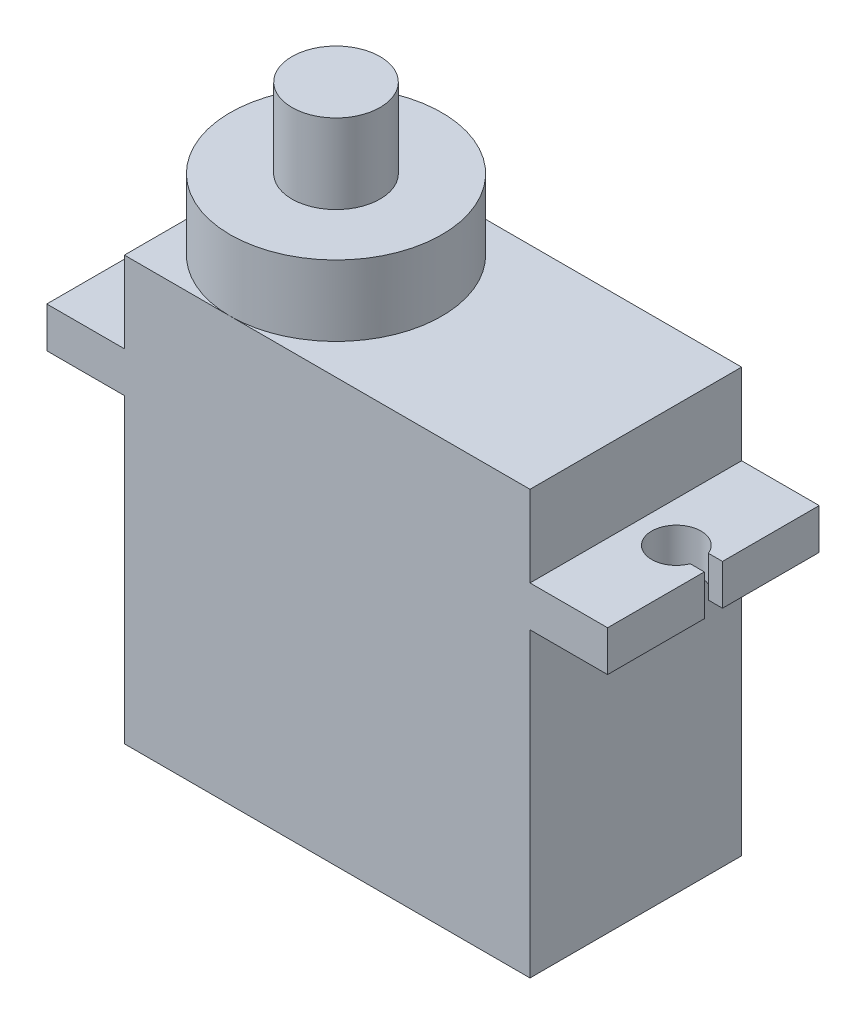
ISO-10303-21;
HEADER;
FILE_DESCRIPTION(('STEP AP214'),'2;1');
FILE_NAME('part.step','',(''),(''),'','','');
FILE_SCHEMA(('AUTOMOTIVE_DESIGN { 1 0 10303 214 1 1 1 1 }'));
ENDSEC;
DATA;
#1=APPLICATION_CONTEXT('core data for automotive mechanical design processes');
#2=APPLICATION_PROTOCOL_DEFINITION('international standard','automotive_design',2000,#1);
#3=PRODUCT_CONTEXT('',#1,'mechanical');
#4=PRODUCT('Part','Part','',(#3));
#5=PRODUCT_RELATED_PRODUCT_CATEGORY('part','',(#4));
#6=PRODUCT_DEFINITION_FORMATION('','',#4);
#7=PRODUCT_DEFINITION_CONTEXT('part definition',#1,'design');
#8=PRODUCT_DEFINITION('design','',#6,#7);
#9=PRODUCT_DEFINITION_SHAPE('','',#8);
#10=(LENGTH_UNIT() NAMED_UNIT(*) SI_UNIT(.MILLI.,.METRE.));
#11=(NAMED_UNIT(*) PLANE_ANGLE_UNIT() SI_UNIT($,.RADIAN.));
#12=(NAMED_UNIT(*) SI_UNIT($,.STERADIAN.) SOLID_ANGLE_UNIT());
#13=UNCERTAINTY_MEASURE_WITH_UNIT(LENGTH_MEASURE(1.E-05),#10,'distance_accuracy_value','');
#14=(GEOMETRIC_REPRESENTATION_CONTEXT(3) GLOBAL_UNCERTAINTY_ASSIGNED_CONTEXT((#13)) GLOBAL_UNIT_ASSIGNED_CONTEXT((#10,
#11,#12)) REPRESENTATION_CONTEXT('',''));
#15=CARTESIAN_POINT('',(0.,0.,0.));
#16=DIRECTION('',(0.,0.,1.));
#17=DIRECTION('',(1.,0.,0.));
#18=AXIS2_PLACEMENT_3D('',#15,#16,#17);
#19=CARTESIAN_POINT('',(0.,24.,0.));
#20=DIRECTION('',(0.,1.,0.));
#21=DIRECTION('',(0.,0.,1.));
#22=AXIS2_PLACEMENT_3D('',#19,#20,#21);
#23=PLANE('',#22);
#24=CARTESIAN_POINT('',(-5.5,24.,0.));
#25=DIRECTION('',(0.,1.,0.));
#26=DIRECTION('',(0.,0.,1.));
#27=AXIS2_PLACEMENT_3D('',#24,#25,#26);
#28=CIRCLE('',#27,6.);
#29=CARTESIAN_POINT('',(-5.5,24.,6.));
#30=VERTEX_POINT('',#29);
#31=CARTESIAN_POINT('',(-5.5,24.,-6.));
#32=VERTEX_POINT('',#31);
#33=EDGE_CURVE('E206',#30,#32,#28,.T.);
#34=ORIENTED_EDGE('',*,*,#33,.F.);
#35=DIRECTION('',(1.,0.,0.));
#36=VECTOR('',#35,1.);
#37=CARTESIAN_POINT('',(11.5,24.,6.));
#38=LINE('',#37,#36);
#39=CARTESIAN_POINT('',(11.5,24.,6.));
#40=VERTEX_POINT('',#39);
#41=EDGE_CURVE('E193',#30,#40,#38,.T.);
#42=ORIENTED_EDGE('',*,*,#41,.T.);
#43=DIRECTION('',(0.,0.,-1.));
#44=VECTOR('',#43,1.);
#45=CARTESIAN_POINT('',(11.5,24.,6.));
#46=LINE('',#45,#44);
#47=CARTESIAN_POINT('',(11.5,24.,-6.));
#48=VERTEX_POINT('',#47);
#49=EDGE_CURVE('E192',#40,#48,#46,.T.);
#50=ORIENTED_EDGE('',*,*,#49,.T.);
#51=DIRECTION('',(-1.,0.,0.));
#52=VECTOR('',#51,1.);
#53=CARTESIAN_POINT('',(11.5,24.,-6.));
#54=LINE('',#53,#52);
#55=EDGE_CURVE('E208',#48,#32,#54,.T.);
#56=ORIENTED_EDGE('',*,*,#55,.T.);
#57=EDGE_LOOP('',(#34,#42,#50,#56));
#58=FACE_BOUND('',#57,.T.);
#59=ADVANCED_FACE('F39',(#58),#23,.T.);
#60=CARTESIAN_POINT('',(-11.5,24.,0.));
#61=VERTEX_POINT('',#60);
#62=EDGE_CURVE('E48',#32,#61,#28,.T.);
#63=ORIENTED_EDGE('',*,*,#62,.F.);
#64=CARTESIAN_POINT('',(-11.5,24.,-6.));
#65=VERTEX_POINT('',#64);
#66=EDGE_CURVE('E330',#32,#65,#54,.T.);
#67=ORIENTED_EDGE('',*,*,#66,.T.);
#68=DIRECTION('',(0.,0.,1.));
#69=VECTOR('',#68,1.);
#70=CARTESIAN_POINT('',(-11.5,24.,6.));
#71=LINE('',#70,#69);
#72=EDGE_CURVE('E203',#65,#61,#71,.T.);
#73=ORIENTED_EDGE('',*,*,#72,.T.);
#74=EDGE_LOOP('',(#63,#67,#73));
#75=FACE_BOUND('',#74,.T.);
#76=ADVANCED_FACE('F385',(#75),#23,.T.);
#77=CARTESIAN_POINT('',(15.9,19.4,-6.));
#78=DIRECTION('',(0.,1.,0.));
#79=DIRECTION('',(0.,0.,1.));
#80=AXIS2_PLACEMENT_3D('',#77,#78,#79);
#81=PLANE('',#80);
#82=DIRECTION('',(0.,0.,-1.));
#83=VECTOR('',#82,1.);
#84=CARTESIAN_POINT('',(15.9,19.4,-6.));
#85=LINE('',#84,#83);
#86=CARTESIAN_POINT('',(15.9,19.4,6.));
#87=VERTEX_POINT('',#86);
#88=CARTESIAN_POINT('',(15.9,19.4,0.515720138550796));
#89=VERTEX_POINT('',#88);
#90=EDGE_CURVE('E249',#87,#89,#85,.T.);
#91=ORIENTED_EDGE('',*,*,#90,.T.);
#92=DIRECTION('',(-1.,0.,0.));
#93=VECTOR('',#92,1.);
#94=CARTESIAN_POINT('',(15.1015501291511,19.4,0.515720138550796));
#95=LINE('',#94,#93);
#96=CARTESIAN_POINT('',(15.1015501291511,19.4,0.515720138550796));
#97=VERTEX_POINT('',#96);
#98=EDGE_CURVE('E229',#89,#97,#95,.T.);
#99=ORIENTED_EDGE('',*,*,#98,.T.);
#100=CARTESIAN_POINT('',(13.8,19.4,0.));
#101=DIRECTION('',(0.,-1.,0.));
#102=DIRECTION('',(0.,0.,1.));
#103=AXIS2_PLACEMENT_3D('',#100,#101,#102);
#104=CIRCLE('',#103,1.4);
#105=CARTESIAN_POINT('',(15.1015501291511,19.4,-0.515720138550795));
#106=VERTEX_POINT('',#105);
#107=EDGE_CURVE('E226',#97,#106,#104,.T.);
#108=ORIENTED_EDGE('',*,*,#107,.T.);
#109=DIRECTION('',(1.,0.,0.));
#110=VECTOR('',#109,1.);
#111=CARTESIAN_POINT('',(15.1015501291511,19.4,-0.515720138550795));
#112=LINE('',#111,#110);
#113=CARTESIAN_POINT('',(15.9,19.4,-0.515720138550796));
#114=VERTEX_POINT('',#113);
#115=EDGE_CURVE('E223',#106,#114,#112,.T.);
#116=ORIENTED_EDGE('',*,*,#115,.T.);
#117=CARTESIAN_POINT('',(15.9,19.4,-6.));
#118=VERTEX_POINT('',#117);
#119=EDGE_CURVE('E247',#114,#118,#85,.T.);
#120=ORIENTED_EDGE('',*,*,#119,.T.);
#121=DIRECTION('',(-1.,0.,0.));
#122=VECTOR('',#121,1.);
#123=CARTESIAN_POINT('',(15.9,19.4,-6.));
#124=LINE('',#123,#122);
#125=CARTESIAN_POINT('',(11.5,19.4,-6.));
#126=VERTEX_POINT('',#125);
#127=EDGE_CURVE('E269',#118,#126,#124,.T.);
#128=ORIENTED_EDGE('',*,*,#127,.T.);
#129=DIRECTION('',(0.,0.,-1.));
#130=VECTOR('',#129,1.);
#131=CARTESIAN_POINT('',(11.5,19.4,-6.));
#132=LINE('',#131,#130);
#133=CARTESIAN_POINT('',(11.5,19.4,6.));
#134=VERTEX_POINT('',#133);
#135=EDGE_CURVE('E243',#134,#126,#132,.T.);
#136=ORIENTED_EDGE('',*,*,#135,.F.);
#137=DIRECTION('',(-1.,0.,0.));
#138=VECTOR('',#137,1.);
#139=CARTESIAN_POINT('',(15.9,19.4,6.));
#140=LINE('',#139,#138);
#141=EDGE_CURVE('E267',#87,#134,#140,.T.);
#142=ORIENTED_EDGE('',*,*,#141,.F.);
#143=EDGE_LOOP('',(#91,#99,#108,#116,#120,#128,#136,#142));
#144=FACE_BOUND('',#143,.T.);
#145=ADVANCED_FACE('F379',(#144),#81,.T.);
#146=CARTESIAN_POINT('',(15.9,17.1,-6.));
#147=DIRECTION('',(0.,-1.,0.));
#148=DIRECTION('',(0.,0.,-1.));
#149=AXIS2_PLACEMENT_3D('',#146,#147,#148);
#150=PLANE('',#149);
#151=CARTESIAN_POINT('',(13.8,17.1,0.));
#152=DIRECTION('',(0.,-1.,0.));
#153=DIRECTION('',(0.,0.,-1.));
#154=AXIS2_PLACEMENT_3D('',#151,#152,#153);
#155=CIRCLE('',#154,1.4);
#156=CARTESIAN_POINT('',(15.1015501291511,17.1,0.515720138550796));
#157=VERTEX_POINT('',#156);
#158=CARTESIAN_POINT('',(15.1015501291511,17.1,-0.515720138550795));
#159=VERTEX_POINT('',#158);
#160=EDGE_CURVE('E217',#157,#159,#155,.T.);
#161=ORIENTED_EDGE('',*,*,#160,.F.);
#162=DIRECTION('',(-1.,0.,0.));
#163=VECTOR('',#162,1.);
#164=CARTESIAN_POINT('',(15.1015501291511,17.1,0.515720138550796));
#165=LINE('',#164,#163);
#166=CARTESIAN_POINT('',(15.9,17.1,0.515720138550796));
#167=VERTEX_POINT('',#166);
#168=EDGE_CURVE('E220',#167,#157,#165,.T.);
#169=ORIENTED_EDGE('',*,*,#168,.F.);
#170=DIRECTION('',(0.,0.,1.));
#171=VECTOR('',#170,1.);
#172=CARTESIAN_POINT('',(15.9,17.1,-6.));
#173=LINE('',#172,#171);
#174=CARTESIAN_POINT('',(15.9,17.1,6.));
#175=VERTEX_POINT('',#174);
#176=EDGE_CURVE('E255',#167,#175,#173,.T.);
#177=ORIENTED_EDGE('',*,*,#176,.T.);
#178=DIRECTION('',(-1.,0.,0.));
#179=VECTOR('',#178,1.);
#180=CARTESIAN_POINT('',(15.9,17.1,6.));
#181=LINE('',#180,#179);
#182=CARTESIAN_POINT('',(11.5,17.1,6.));
#183=VERTEX_POINT('',#182);
#184=EDGE_CURVE('E265',#175,#183,#181,.T.);
#185=ORIENTED_EDGE('',*,*,#184,.T.);
#186=DIRECTION('',(0.,0.,1.));
#187=VECTOR('',#186,1.);
#188=CARTESIAN_POINT('',(11.5,17.1,-6.));
#189=LINE('',#188,#187);
#190=CARTESIAN_POINT('',(11.5,17.1,-6.));
#191=VERTEX_POINT('',#190);
#192=EDGE_CURVE('E248',#191,#183,#189,.T.);
#193=ORIENTED_EDGE('',*,*,#192,.F.);
#194=DIRECTION('',(-1.,0.,0.));
#195=VECTOR('',#194,1.);
#196=CARTESIAN_POINT('',(15.9,17.1,-6.));
#197=LINE('',#196,#195);
#198=CARTESIAN_POINT('',(15.9,17.1,-6.));
#199=VERTEX_POINT('',#198);
#200=EDGE_CURVE('E259',#199,#191,#197,.T.);
#201=ORIENTED_EDGE('',*,*,#200,.F.);
#202=CARTESIAN_POINT('',(15.9,17.1,-0.515720138550796));
#203=VERTEX_POINT('',#202);
#204=EDGE_CURVE('E256',#199,#203,#173,.T.);
#205=ORIENTED_EDGE('',*,*,#204,.T.);
#206=DIRECTION('',(1.,0.,0.));
#207=VECTOR('',#206,1.);
#208=CARTESIAN_POINT('',(15.1015501291511,17.1,-0.515720138550795));
#209=LINE('',#208,#207);
#210=EDGE_CURVE('E236',#159,#203,#209,.T.);
#211=ORIENTED_EDGE('',*,*,#210,.F.);
#212=EDGE_LOOP('',(#161,#169,#177,#185,#193,#201,#205,#211));
#213=FACE_BOUND('',#212,.T.);
#214=ADVANCED_FACE('F371',(#213),#150,.T.);
#215=CARTESIAN_POINT('',(15.9,0.,0.));
#216=DIRECTION('',(-1.,0.,0.));
#217=DIRECTION('',(0.,0.,-1.));
#218=AXIS2_PLACEMENT_3D('',#215,#216,#217);
#219=PLANE('',#218);
#220=DIRECTION('',(0.,1.,0.));
#221=VECTOR('',#220,1.);
#222=CARTESIAN_POINT('',(15.9,-0.001000000000001,0.515720138550796));
#223=LINE('',#222,#221);
#224=EDGE_CURVE('E233',#167,#89,#223,.T.);
#225=ORIENTED_EDGE('',*,*,#224,.T.);
#226=ORIENTED_EDGE('',*,*,#90,.F.);
#227=DIRECTION('',(0.,1.,0.));
#228=VECTOR('',#227,1.);
#229=CARTESIAN_POINT('',(15.9,17.1,6.));
#230=LINE('',#229,#228);
#231=EDGE_CURVE('E252',#175,#87,#230,.T.);
#232=ORIENTED_EDGE('',*,*,#231,.F.);
#233=ORIENTED_EDGE('',*,*,#176,.F.);
#234=EDGE_LOOP('',(#225,#226,#232,#233));
#235=FACE_BOUND('',#234,.T.);
#236=ADVANCED_FACE('F377',(#235),#219,.F.);
#237=DIRECTION('',(0.,1.,0.));
#238=VECTOR('',#237,1.);
#239=CARTESIAN_POINT('',(15.9,-0.001000000000001,-0.515720138550796));
#240=LINE('',#239,#238);
#241=EDGE_CURVE('E232',#203,#114,#240,.T.);
#242=ORIENTED_EDGE('',*,*,#241,.F.);
#243=ORIENTED_EDGE('',*,*,#204,.F.);
#244=DIRECTION('',(0.,-1.,0.));
#245=VECTOR('',#244,1.);
#246=CARTESIAN_POINT('',(15.9,17.1,-6.));
#247=LINE('',#246,#245);
#248=EDGE_CURVE('E244',#118,#199,#247,.T.);
#249=ORIENTED_EDGE('',*,*,#248,.F.);
#250=ORIENTED_EDGE('',*,*,#119,.F.);
#251=EDGE_LOOP('',(#242,#243,#249,#250));
#252=FACE_BOUND('',#251,.T.);
#253=ADVANCED_FACE('F437',(#252),#219,.F.);
#254=CARTESIAN_POINT('',(11.5,24.,6.));
#255=DIRECTION('',(-1.,0.,0.));
#256=DIRECTION('',(0.,0.,1.));
#257=AXIS2_PLACEMENT_3D('',#254,#255,#256);
#258=PLANE('',#257);
#259=DIRECTION('',(0.,-1.,0.));
#260=VECTOR('',#259,1.);
#261=CARTESIAN_POINT('',(11.5,24.,-6.));
#262=LINE('',#261,#260);
#263=CARTESIAN_POINT('',(11.5,0.,-6.));
#264=VERTEX_POINT('',#263);
#265=EDGE_CURVE('E345',#191,#264,#262,.T.);
#266=ORIENTED_EDGE('',*,*,#265,.F.);
#267=ORIENTED_EDGE('',*,*,#192,.T.);
#268=DIRECTION('',(0.,-1.,0.));
#269=VECTOR('',#268,1.);
#270=CARTESIAN_POINT('',(11.5,24.,6.));
#271=LINE('',#270,#269);
#272=CARTESIAN_POINT('',(11.5,0.,6.));
#273=VERTEX_POINT('',#272);
#274=EDGE_CURVE('E348',#183,#273,#271,.T.);
#275=ORIENTED_EDGE('',*,*,#274,.T.);
#276=DIRECTION('',(0.,0.,-1.));
#277=VECTOR('',#276,1.);
#278=CARTESIAN_POINT('',(11.5,0.,6.));
#279=LINE('',#278,#277);
#280=EDGE_CURVE('E337',#273,#264,#279,.T.);
#281=ORIENTED_EDGE('',*,*,#280,.T.);
#282=EDGE_LOOP('',(#266,#267,#275,#281));
#283=FACE_BOUND('',#282,.T.);
#284=ADVANCED_FACE('F353',(#283),#258,.F.);
#285=CARTESIAN_POINT('',(-15.9,0.,0.));
#286=DIRECTION('',(1.,0.,0.));
#287=DIRECTION('',(0.,0.,-1.));
#288=AXIS2_PLACEMENT_3D('',#285,#286,#287);
#289=PLANE('',#288);
#290=DIRECTION('',(0.,0.,1.));
#291=VECTOR('',#290,1.);
#292=CARTESIAN_POINT('',(-15.9,17.1,-6.));
#293=LINE('',#292,#291);
#294=CARTESIAN_POINT('',(-15.9,17.1,-6.));
#295=VERTEX_POINT('',#294);
#296=CARTESIAN_POINT('',(-15.9,17.1,-0.515720138550796));
#297=VERTEX_POINT('',#296);
#298=EDGE_CURVE('E302',#295,#297,#293,.T.);
#299=ORIENTED_EDGE('',*,*,#298,.T.);
#300=DIRECTION('',(0.,1.,0.));
#301=VECTOR('',#300,1.);
#302=CARTESIAN_POINT('',(-15.9,-0.001000000000001,-0.515720138550796));
#303=LINE('',#302,#301);
#304=CARTESIAN_POINT('',(-15.9,19.4,-0.515720138550796));
#305=VERTEX_POINT('',#304);
#306=EDGE_CURVE('E286',#297,#305,#303,.T.);
#307=ORIENTED_EDGE('',*,*,#306,.T.);
#308=DIRECTION('',(0.,0.,-1.));
#309=VECTOR('',#308,1.);
#310=CARTESIAN_POINT('',(-15.9,19.4,-6.));
#311=LINE('',#310,#309);
#312=CARTESIAN_POINT('',(-15.9,19.4,-6.));
#313=VERTEX_POINT('',#312);
#314=EDGE_CURVE('E307',#305,#313,#311,.T.);
#315=ORIENTED_EDGE('',*,*,#314,.T.);
#316=DIRECTION('',(0.,-1.,0.));
#317=VECTOR('',#316,1.);
#318=CARTESIAN_POINT('',(-15.9,17.1,-6.));
#319=LINE('',#318,#317);
#320=EDGE_CURVE('E297',#313,#295,#319,.T.);
#321=ORIENTED_EDGE('',*,*,#320,.T.);
#322=EDGE_LOOP('',(#299,#307,#315,#321));
#323=FACE_BOUND('',#322,.T.);
#324=ADVANCED_FACE('F414',(#323),#289,.F.);
#325=CARTESIAN_POINT('',(-11.5,24.,6.));
#326=DIRECTION('',(1.,0.,0.));
#327=DIRECTION('',(0.,0.,-1.));
#328=AXIS2_PLACEMENT_3D('',#325,#326,#327);
#329=PLANE('',#328);
#330=DIRECTION('',(0.,0.,-1.));
#331=VECTOR('',#330,1.);
#332=CARTESIAN_POINT('',(-11.5,19.4,-6.));
#333=LINE('',#332,#331);
#334=CARTESIAN_POINT('',(-11.5,19.4,6.));
#335=VERTEX_POINT('',#334);
#336=CARTESIAN_POINT('',(-11.5,19.4,-6.));
#337=VERTEX_POINT('',#336);
#338=EDGE_CURVE('E301',#335,#337,#333,.T.);
#339=ORIENTED_EDGE('',*,*,#338,.F.);
#340=DIRECTION('',(0.,-1.,0.));
#341=VECTOR('',#340,1.);
#342=CARTESIAN_POINT('',(-11.5,24.,6.));
#343=LINE('',#342,#341);
#344=CARTESIAN_POINT('',(-11.5,24.,6.));
#345=VERTEX_POINT('',#344);
#346=EDGE_CURVE('E43',#345,#335,#343,.T.);
#347=ORIENTED_EDGE('',*,*,#346,.F.);
#348=EDGE_CURVE('E188',#61,#345,#71,.T.);
#349=ORIENTED_EDGE('',*,*,#348,.F.);
#350=ORIENTED_EDGE('',*,*,#72,.F.);
#351=DIRECTION('',(0.,-1.,0.));
#352=VECTOR('',#351,1.);
#353=CARTESIAN_POINT('',(-11.5,24.,-6.));
#354=LINE('',#353,#352);
#355=EDGE_CURVE('E343',#65,#337,#354,.T.);
#356=ORIENTED_EDGE('',*,*,#355,.T.);
#357=EDGE_LOOP('',(#339,#347,#349,#350,#356));
#358=FACE_BOUND('',#357,.T.);
#359=ADVANCED_FACE('F41',(#358),#329,.F.);
#360=DIRECTION('',(0.,0.,1.));
#361=VECTOR('',#360,1.);
#362=CARTESIAN_POINT('',(-11.5,17.1,-6.));
#363=LINE('',#362,#361);
#364=CARTESIAN_POINT('',(-11.5,17.1,-6.));
#365=VERTEX_POINT('',#364);
#366=CARTESIAN_POINT('',(-11.5,17.1,6.));
#367=VERTEX_POINT('',#366);
#368=EDGE_CURVE('E296',#365,#367,#363,.T.);
#369=ORIENTED_EDGE('',*,*,#368,.F.);
#370=CARTESIAN_POINT('',(-11.5,0.,-6.));
#371=VERTEX_POINT('',#370);
#372=EDGE_CURVE('E332',#365,#371,#354,.T.);
#373=ORIENTED_EDGE('',*,*,#372,.T.);
#374=DIRECTION('',(0.,0.,1.));
#375=VECTOR('',#374,1.);
#376=CARTESIAN_POINT('',(-11.5,0.,6.));
#377=LINE('',#376,#375);
#378=CARTESIAN_POINT('',(-11.5,0.,6.));
#379=VERTEX_POINT('',#378);
#380=EDGE_CURVE('E327',#371,#379,#377,.T.);
#381=ORIENTED_EDGE('',*,*,#380,.T.);
#382=EDGE_CURVE('E214',#367,#379,#343,.T.);
#383=ORIENTED_EDGE('',*,*,#382,.F.);
#384=EDGE_LOOP('',(#369,#373,#381,#383));
#385=FACE_BOUND('',#384,.T.);
#386=ADVANCED_FACE('F406',(#385),#329,.F.);
#387=CARTESIAN_POINT('',(11.5,24.,6.));
#388=DIRECTION('',(0.,0.,-1.));
#389=DIRECTION('',(-1.,0.,0.));
#390=AXIS2_PLACEMENT_3D('',#387,#388,#389);
#391=PLANE('',#390);
#392=DIRECTION('',(1.,0.,0.));
#393=VECTOR('',#392,1.);
#394=CARTESIAN_POINT('',(11.5,0.,6.));
#395=LINE('',#394,#393);
#396=EDGE_CURVE('E335',#379,#273,#395,.T.);
#397=ORIENTED_EDGE('',*,*,#396,.T.);
#398=ORIENTED_EDGE('',*,*,#274,.F.);
#399=ORIENTED_EDGE('',*,*,#184,.F.);
#400=ORIENTED_EDGE('',*,*,#231,.T.);
#401=ORIENTED_EDGE('',*,*,#141,.T.);
#402=EDGE_CURVE('E200',#40,#134,#271,.T.);
#403=ORIENTED_EDGE('',*,*,#402,.F.);
#404=ORIENTED_EDGE('',*,*,#41,.F.);
#405=EDGE_CURVE('E185',#345,#30,#38,.T.);
#406=ORIENTED_EDGE('',*,*,#405,.F.);
#407=ORIENTED_EDGE('',*,*,#346,.T.);
#408=DIRECTION('',(1.,0.,0.));
#409=VECTOR('',#408,1.);
#410=CARTESIAN_POINT('',(-15.9,19.4,6.));
#411=LINE('',#410,#409);
#412=CARTESIAN_POINT('',(-15.9,19.4,6.));
#413=VERTEX_POINT('',#412);
#414=EDGE_CURVE('E318',#413,#335,#411,.T.);
#415=ORIENTED_EDGE('',*,*,#414,.F.);
#416=DIRECTION('',(0.,1.,0.));
#417=VECTOR('',#416,1.);
#418=CARTESIAN_POINT('',(-15.9,17.1,6.));
#419=LINE('',#418,#417);
#420=CARTESIAN_POINT('',(-15.9,17.1,6.));
#421=VERTEX_POINT('',#420);
#422=EDGE_CURVE('E305',#421,#413,#419,.T.);
#423=ORIENTED_EDGE('',*,*,#422,.F.);
#424=DIRECTION('',(1.,0.,0.));
#425=VECTOR('',#424,1.);
#426=CARTESIAN_POINT('',(-15.9,17.1,6.));
#427=LINE('',#426,#425);
#428=EDGE_CURVE('E321',#421,#367,#427,.T.);
#429=ORIENTED_EDGE('',*,*,#428,.T.);
#430=ORIENTED_EDGE('',*,*,#382,.T.);
#431=EDGE_LOOP('',(#397,#398,#399,#400,#401,#403,#404,#406,#407,#415,#423,#429,#430));
#432=FACE_BOUND('',#431,.T.);
#433=ADVANCED_FACE('F198',(#432),#391,.F.);
#434=ORIENTED_EDGE('',*,*,#402,.T.);
#435=ORIENTED_EDGE('',*,*,#135,.T.);
#436=EDGE_CURVE('E346',#48,#126,#262,.T.);
#437=ORIENTED_EDGE('',*,*,#436,.F.);
#438=ORIENTED_EDGE('',*,*,#49,.F.);
#439=EDGE_LOOP('',(#434,#435,#437,#438));
#440=FACE_BOUND('',#439,.T.);
#441=ADVANCED_FACE('F382',(#440),#258,.F.);
#442=CARTESIAN_POINT('',(11.5,24.,-6.));
#443=DIRECTION('',(0.,0.,1.));
#444=DIRECTION('',(1.,0.,0.));
#445=AXIS2_PLACEMENT_3D('',#442,#443,#444);
#446=PLANE('',#445);
#447=DIRECTION('',(-1.,0.,0.));
#448=VECTOR('',#447,1.);
#449=CARTESIAN_POINT('',(11.5,0.,-6.));
#450=LINE('',#449,#448);
#451=EDGE_CURVE('E340',#264,#371,#450,.T.);
#452=ORIENTED_EDGE('',*,*,#451,.T.);
#453=ORIENTED_EDGE('',*,*,#372,.F.);
#454=DIRECTION('',(1.,0.,0.));
#455=VECTOR('',#454,1.);
#456=CARTESIAN_POINT('',(-15.9,17.1,-6.));
#457=LINE('',#456,#455);
#458=EDGE_CURVE('E324',#295,#365,#457,.T.);
#459=ORIENTED_EDGE('',*,*,#458,.F.);
#460=ORIENTED_EDGE('',*,*,#320,.F.);
#461=DIRECTION('',(1.,0.,0.));
#462=VECTOR('',#461,1.);
#463=CARTESIAN_POINT('',(-15.9,19.4,-6.));
#464=LINE('',#463,#462);
#465=EDGE_CURVE('E311',#313,#337,#464,.T.);
#466=ORIENTED_EDGE('',*,*,#465,.T.);
#467=ORIENTED_EDGE('',*,*,#355,.F.);
#468=ORIENTED_EDGE('',*,*,#66,.F.);
#469=ORIENTED_EDGE('',*,*,#55,.F.);
#470=ORIENTED_EDGE('',*,*,#436,.T.);
#471=ORIENTED_EDGE('',*,*,#127,.F.);
#472=ORIENTED_EDGE('',*,*,#248,.T.);
#473=ORIENTED_EDGE('',*,*,#200,.T.);
#474=ORIENTED_EDGE('',*,*,#265,.T.);
#475=EDGE_LOOP('',(#452,#453,#459,#460,#466,#467,#468,#469,#470,#471,#472,#473,#474));
#476=FACE_BOUND('',#475,.T.);
#477=ADVANCED_FACE('F364',(#476),#446,.F.);
#478=EDGE_CURVE('E63',#61,#30,#28,.T.);
#479=ORIENTED_EDGE('',*,*,#478,.F.);
#480=ORIENTED_EDGE('',*,*,#348,.T.);
#481=ORIENTED_EDGE('',*,*,#405,.T.);
#482=EDGE_LOOP('',(#479,#480,#481));
#483=FACE_BOUND('',#482,.T.);
#484=ADVANCED_FACE('F187',(#483),#23,.T.);
#485=CARTESIAN_POINT('',(0.,0.,0.));
#486=DIRECTION('',(0.,1.,0.));
#487=DIRECTION('',(0.,0.,1.));
#488=AXIS2_PLACEMENT_3D('',#485,#486,#487);
#489=PLANE('',#488);
#490=ORIENTED_EDGE('',*,*,#380,.F.);
#491=ORIENTED_EDGE('',*,*,#451,.F.);
#492=ORIENTED_EDGE('',*,*,#280,.F.);
#493=ORIENTED_EDGE('',*,*,#396,.F.);
#494=EDGE_LOOP('',(#490,#491,#492,#493));
#495=FACE_BOUND('',#494,.T.);
#496=ADVANCED_FACE('F361',(#495),#489,.F.);
#497=CARTESIAN_POINT('',(-15.9,17.1,-6.));
#498=DIRECTION('',(0.,1.,0.));
#499=DIRECTION('',(0.,0.,1.));
#500=AXIS2_PLACEMENT_3D('',#497,#498,#499);
#501=PLANE('',#500);
#502=CARTESIAN_POINT('',(-13.8,17.1,0.));
#503=DIRECTION('',(0.,1.,0.));
#504=DIRECTION('',(0.,0.,1.));
#505=AXIS2_PLACEMENT_3D('',#502,#503,#504);
#506=CIRCLE('',#505,1.4);
#507=CARTESIAN_POINT('',(-15.1015501291511,17.1,-0.515720138550795));
#508=VERTEX_POINT('',#507);
#509=CARTESIAN_POINT('',(-15.1015501291511,17.1,0.515720138550796));
#510=VERTEX_POINT('',#509);
#511=EDGE_CURVE('E271',#508,#510,#506,.F.);
#512=ORIENTED_EDGE('',*,*,#511,.F.);
#513=DIRECTION('',(1.,0.,0.));
#514=VECTOR('',#513,1.);
#515=CARTESIAN_POINT('',(-15.1015501291511,17.1,-0.515720138550795));
#516=LINE('',#515,#514);
#517=EDGE_CURVE('E274',#297,#508,#516,.T.);
#518=ORIENTED_EDGE('',*,*,#517,.F.);
#519=ORIENTED_EDGE('',*,*,#298,.F.);
#520=ORIENTED_EDGE('',*,*,#458,.T.);
#521=ORIENTED_EDGE('',*,*,#368,.T.);
#522=ORIENTED_EDGE('',*,*,#428,.F.);
#523=CARTESIAN_POINT('',(-15.9,17.1,0.515720138550797));
#524=VERTEX_POINT('',#523);
#525=EDGE_CURVE('E300',#524,#421,#293,.T.);
#526=ORIENTED_EDGE('',*,*,#525,.F.);
#527=DIRECTION('',(-1.,0.,0.));
#528=VECTOR('',#527,1.);
#529=CARTESIAN_POINT('',(-15.1015501291511,17.1,0.515720138550796));
#530=LINE('',#529,#528);
#531=EDGE_CURVE('E289',#510,#524,#530,.T.);
#532=ORIENTED_EDGE('',*,*,#531,.F.);
#533=EDGE_LOOP('',(#512,#518,#519,#520,#521,#522,#526,#532));
#534=FACE_BOUND('',#533,.T.);
#535=ADVANCED_FACE('F403',(#534),#501,.F.);
#536=CARTESIAN_POINT('',(-15.9,19.4,-6.));
#537=DIRECTION('',(0.,-1.,0.));
#538=DIRECTION('',(0.,0.,-1.));
#539=AXIS2_PLACEMENT_3D('',#536,#537,#538);
#540=PLANE('',#539);
#541=ORIENTED_EDGE('',*,*,#314,.F.);
#542=DIRECTION('',(-1.,0.,0.));
#543=VECTOR('',#542,1.);
#544=CARTESIAN_POINT('',(-15.1015501291511,19.4,-0.515720138550795));
#545=LINE('',#544,#543);
#546=CARTESIAN_POINT('',(-15.1015501291511,19.4,-0.515720138550795));
#547=VERTEX_POINT('',#546);
#548=EDGE_CURVE('E283',#547,#305,#545,.T.);
#549=ORIENTED_EDGE('',*,*,#548,.F.);
#550=CARTESIAN_POINT('',(-13.8,19.4,0.));
#551=DIRECTION('',(0.,1.,0.));
#552=DIRECTION('',(0.,0.,1.));
#553=AXIS2_PLACEMENT_3D('',#550,#551,#552);
#554=CIRCLE('',#553,1.4);
#555=CARTESIAN_POINT('',(-15.1015501291511,19.4,0.515720138550796));
#556=VERTEX_POINT('',#555);
#557=EDGE_CURVE('E280',#556,#547,#554,.T.);
#558=ORIENTED_EDGE('',*,*,#557,.F.);
#559=DIRECTION('',(1.,0.,0.));
#560=VECTOR('',#559,1.);
#561=CARTESIAN_POINT('',(-15.1015501291511,19.4,0.515720138550796));
#562=LINE('',#561,#560);
#563=CARTESIAN_POINT('',(-15.9,19.4,0.515720138550796));
#564=VERTEX_POINT('',#563);
#565=EDGE_CURVE('E277',#564,#556,#562,.T.);
#566=ORIENTED_EDGE('',*,*,#565,.F.);
#567=EDGE_CURVE('E308',#413,#564,#311,.T.);
#568=ORIENTED_EDGE('',*,*,#567,.F.);
#569=ORIENTED_EDGE('',*,*,#414,.T.);
#570=ORIENTED_EDGE('',*,*,#338,.T.);
#571=ORIENTED_EDGE('',*,*,#465,.F.);
#572=EDGE_LOOP('',(#541,#549,#558,#566,#568,#569,#570,#571));
#573=FACE_BOUND('',#572,.T.);
#574=ADVANCED_FACE('F392',(#573),#540,.F.);
#575=ORIENTED_EDGE('',*,*,#567,.T.);
#576=DIRECTION('',(0.,1.,0.));
#577=VECTOR('',#576,1.);
#578=CARTESIAN_POINT('',(-15.9,-0.001000000000001,0.515720138550796));
#579=LINE('',#578,#577);
#580=EDGE_CURVE('E285',#524,#564,#579,.T.);
#581=ORIENTED_EDGE('',*,*,#580,.F.);
#582=ORIENTED_EDGE('',*,*,#525,.T.);
#583=ORIENTED_EDGE('',*,*,#422,.T.);
#584=EDGE_LOOP('',(#575,#581,#582,#583));
#585=FACE_BOUND('',#584,.T.);
#586=ADVANCED_FACE('F398',(#585),#289,.F.);
#587=CARTESIAN_POINT('',(-15.1015501291511,-0.001000000000001,-0.515720138550795));
#588=DIRECTION('',(0.,0.,-1.));
#589=DIRECTION('',(-1.,0.,0.));
#590=AXIS2_PLACEMENT_3D('',#587,#588,#589);
#591=PLANE('',#590);
#592=ORIENTED_EDGE('',*,*,#517,.T.);
#593=DIRECTION('',(0.,1.,0.));
#594=VECTOR('',#593,1.);
#595=CARTESIAN_POINT('',(-15.1015501291511,-0.001000000000001,-0.515720138550795));
#596=LINE('',#595,#594);
#597=EDGE_CURVE('E290',#508,#547,#596,.T.);
#598=ORIENTED_EDGE('',*,*,#597,.T.);
#599=ORIENTED_EDGE('',*,*,#548,.T.);
#600=ORIENTED_EDGE('',*,*,#306,.F.);
#601=EDGE_LOOP('',(#592,#598,#599,#600));
#602=FACE_BOUND('',#601,.T.);
#603=ADVANCED_FACE('F457',(#602),#591,.F.);
#604=CARTESIAN_POINT('',(-13.8,-0.001000000000001,0.));
#605=DIRECTION('',(0.,1.,0.));
#606=DIRECTION('',(0.,0.,1.));
#607=AXIS2_PLACEMENT_3D('',#604,#605,#606);
#608=CYLINDRICAL_SURFACE('',#607,1.4);
#609=ORIENTED_EDGE('',*,*,#511,.T.);
#610=DIRECTION('',(0.,1.,0.));
#611=VECTOR('',#610,1.);
#612=CARTESIAN_POINT('',(-15.1015501291511,-0.001000000000001,0.515720138550796));
#613=LINE('',#612,#611);
#614=EDGE_CURVE('E292',#510,#556,#613,.T.);
#615=ORIENTED_EDGE('',*,*,#614,.T.);
#616=ORIENTED_EDGE('',*,*,#557,.T.);
#617=ORIENTED_EDGE('',*,*,#597,.F.);
#618=EDGE_LOOP('',(#609,#615,#616,#617));
#619=FACE_BOUND('',#618,.T.);
#620=ADVANCED_FACE('F460',(#619),#608,.F.);
#621=CARTESIAN_POINT('',(-15.1015501291511,-0.001000000000001,0.515720138550796));
#622=DIRECTION('',(0.,0.,1.));
#623=DIRECTION('',(1.,0.,0.));
#624=AXIS2_PLACEMENT_3D('',#621,#622,#623);
#625=PLANE('',#624);
#626=ORIENTED_EDGE('',*,*,#531,.T.);
#627=ORIENTED_EDGE('',*,*,#580,.T.);
#628=ORIENTED_EDGE('',*,*,#565,.T.);
#629=ORIENTED_EDGE('',*,*,#614,.F.);
#630=EDGE_LOOP('',(#626,#627,#628,#629));
#631=FACE_BOUND('',#630,.T.);
#632=ADVANCED_FACE('F464',(#631),#625,.F.);
#633=CARTESIAN_POINT('',(15.1015501291511,-0.001000000000001,0.515720138550796));
#634=DIRECTION('',(0.,0.,-1.));
#635=DIRECTION('',(-1.,0.,0.));
#636=AXIS2_PLACEMENT_3D('',#633,#634,#635);
#637=PLANE('',#636);
#638=ORIENTED_EDGE('',*,*,#168,.T.);
#639=DIRECTION('',(0.,1.,0.));
#640=VECTOR('',#639,1.);
#641=CARTESIAN_POINT('',(15.1015501291511,-0.001000000000001,0.515720138550796));
#642=LINE('',#641,#640);
#643=EDGE_CURVE('E237',#157,#97,#642,.T.);
#644=ORIENTED_EDGE('',*,*,#643,.T.);
#645=ORIENTED_EDGE('',*,*,#98,.F.);
#646=ORIENTED_EDGE('',*,*,#224,.F.);
#647=EDGE_LOOP('',(#638,#644,#645,#646));
#648=FACE_BOUND('',#647,.T.);
#649=ADVANCED_FACE('F467',(#648),#637,.T.);
#650=CARTESIAN_POINT('',(13.8,-0.001000000000001,0.));
#651=DIRECTION('',(0.,1.,0.));
#652=DIRECTION('',(0.,0.,1.));
#653=AXIS2_PLACEMENT_3D('',#650,#651,#652);
#654=CYLINDRICAL_SURFACE('',#653,1.4);
#655=ORIENTED_EDGE('',*,*,#160,.T.);
#656=DIRECTION('',(0.,1.,0.));
#657=VECTOR('',#656,1.);
#658=CARTESIAN_POINT('',(15.1015501291511,-0.001000000000001,-0.515720138550795));
#659=LINE('',#658,#657);
#660=EDGE_CURVE('E239',#159,#106,#659,.T.);
#661=ORIENTED_EDGE('',*,*,#660,.T.);
#662=ORIENTED_EDGE('',*,*,#107,.F.);
#663=ORIENTED_EDGE('',*,*,#643,.F.);
#664=EDGE_LOOP('',(#655,#661,#662,#663));
#665=FACE_BOUND('',#664,.T.);
#666=ADVANCED_FACE('F638',(#665),#654,.F.);
#667=CARTESIAN_POINT('',(15.1015501291511,-0.001000000000001,-0.515720138550795));
#668=DIRECTION('',(0.,0.,1.));
#669=DIRECTION('',(1.,0.,0.));
#670=AXIS2_PLACEMENT_3D('',#667,#668,#669);
#671=PLANE('',#670);
#672=ORIENTED_EDGE('',*,*,#210,.T.);
#673=ORIENTED_EDGE('',*,*,#241,.T.);
#674=ORIENTED_EDGE('',*,*,#115,.F.);
#675=ORIENTED_EDGE('',*,*,#660,.F.);
#676=EDGE_LOOP('',(#672,#673,#674,#675));
#677=FACE_BOUND('',#676,.T.);
#678=ADVANCED_FACE('F451',(#677),#671,.T.);
#679=CARTESIAN_POINT('',(-5.5,28.,0.));
#680=DIRECTION('',(0.,-1.,0.));
#681=DIRECTION('',(0.,0.,-1.));
#682=AXIS2_PLACEMENT_3D('',#679,#680,#681);
#683=CYLINDRICAL_SURFACE('',#682,6.);
#684=CARTESIAN_POINT('',(-5.5,28.,0.));
#685=DIRECTION('',(0.,1.,0.));
#686=DIRECTION('',(0.,0.,1.));
#687=AXIS2_PLACEMENT_3D('',#684,#685,#686);
#688=CIRCLE('',#687,6.);
#689=CARTESIAN_POINT('',(-5.5,28.,6.));
#690=VERTEX_POINT('',#689);
#691=EDGE_CURVE('E210',#690,#690,#688,.T.);
#692=ORIENTED_EDGE('',*,*,#691,.F.);
#693=EDGE_LOOP('',(#692));
#694=FACE_BOUND('',#693,.T.);
#695=ORIENTED_EDGE('',*,*,#33,.T.);
#696=ORIENTED_EDGE('',*,*,#62,.T.);
#697=ORIENTED_EDGE('',*,*,#478,.T.);
#698=EDGE_LOOP('',(#695,#696,#697));
#699=FACE_BOUND('',#698,.T.);
#700=ADVANCED_FACE('F213',(#694,#699),#683,.T.);
#701=CARTESIAN_POINT('',(-5.5,28.,0.));
#702=DIRECTION('',(0.,1.,0.));
#703=DIRECTION('',(0.,0.,1.));
#704=AXIS2_PLACEMENT_3D('',#701,#702,#703);
#705=PLANE('',#704);
#706=CARTESIAN_POINT('',(-5.5,28.,0.));
#707=DIRECTION('',(0.,1.,0.));
#708=DIRECTION('',(0.,0.,1.));
#709=AXIS2_PLACEMENT_3D('',#706,#707,#708);
#710=CIRCLE('',#709,2.5);
#711=CARTESIAN_POINT('',(-5.5,28.,2.5));
#712=VERTEX_POINT('',#711);
#713=EDGE_CURVE('E11',#712,#712,#710,.T.);
#714=ORIENTED_EDGE('',*,*,#713,.F.);
#715=EDGE_LOOP('',(#714));
#716=FACE_BOUND('',#715,.T.);
#717=ORIENTED_EDGE('',*,*,#691,.T.);
#718=EDGE_LOOP('',(#717));
#719=FACE_BOUND('',#718,.T.);
#720=ADVANCED_FACE('F602',(#716,#719),#705,.T.);
#721=CARTESIAN_POINT('',(-5.5,32.5,0.));
#722=DIRECTION('',(0.,-1.,0.));
#723=DIRECTION('',(0.,0.,-1.));
#724=AXIS2_PLACEMENT_3D('',#721,#722,#723);
#725=CYLINDRICAL_SURFACE('',#724,2.5);
#726=CARTESIAN_POINT('',(-5.5,32.5,0.));
#727=DIRECTION('',(0.,1.,0.));
#728=DIRECTION('',(0.,0.,1.));
#729=AXIS2_PLACEMENT_3D('',#726,#727,#728);
#730=CIRCLE('',#729,2.5);
#731=CARTESIAN_POINT('',(-5.5,32.5,2.5));
#732=VERTEX_POINT('',#731);
#733=EDGE_CURVE('E211',#732,#732,#730,.T.);
#734=ORIENTED_EDGE('',*,*,#733,.F.);
#735=EDGE_LOOP('',(#734));
#736=FACE_BOUND('',#735,.T.);
#737=ORIENTED_EDGE('',*,*,#713,.T.);
#738=EDGE_LOOP('',(#737));
#739=FACE_BOUND('',#738,.T.);
#740=ADVANCED_FACE('F611',(#736,#739),#725,.T.);
#741=CARTESIAN_POINT('',(-5.5,32.5,0.));
#742=DIRECTION('',(0.,1.,0.));
#743=DIRECTION('',(0.,0.,1.));
#744=AXIS2_PLACEMENT_3D('',#741,#742,#743);
#745=PLANE('',#744);
#746=ORIENTED_EDGE('',*,*,#733,.T.);
#747=EDGE_LOOP('',(#746));
#748=FACE_BOUND('',#747,.T.);
#749=ADVANCED_FACE('F620',(#748),#745,.T.);
#750=CLOSED_SHELL('',(#59,#76,#145,#214,#236,#253,#284,#324,#359,#386,#433,#441,#477,#484,#496,
#535,#574,#586,#603,#620,#632,#649,#666,#678,#700,#720,#740,#749));
#751=MANIFOLD_SOLID_BREP('B2',#750);
#752=ADVANCED_BREP_SHAPE_REPRESENTATION('',(#18,#751),#14);
#753=SHAPE_DEFINITION_REPRESENTATION(#9,#752);
ENDSEC;
END-ISO-10303-21;
